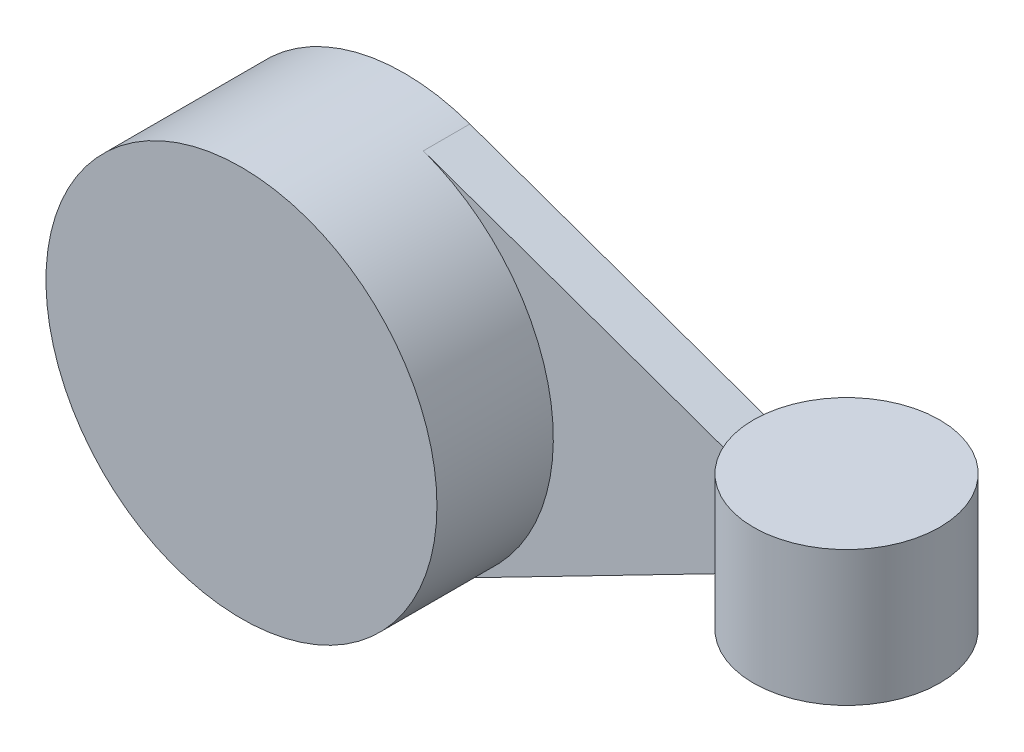
ISO-10303-21;
HEADER;
FILE_DESCRIPTION(('STEP AP214'),'2;1');
FILE_NAME('part.step','',(''),(''),'','','');
FILE_SCHEMA(('AUTOMOTIVE_DESIGN { 1 0 10303 214 1 1 1 1 }'));
ENDSEC;
DATA;
#1=APPLICATION_CONTEXT('core data for automotive mechanical design processes');
#2=APPLICATION_PROTOCOL_DEFINITION('international standard','automotive_design',2000,#1);
#3=PRODUCT_CONTEXT('',#1,'mechanical');
#4=PRODUCT('Part','Part','',(#3));
#5=PRODUCT_RELATED_PRODUCT_CATEGORY('part','',(#4));
#6=PRODUCT_DEFINITION_FORMATION('','',#4);
#7=PRODUCT_DEFINITION_CONTEXT('part definition',#1,'design');
#8=PRODUCT_DEFINITION('design','',#6,#7);
#9=PRODUCT_DEFINITION_SHAPE('','',#8);
#10=(LENGTH_UNIT() NAMED_UNIT(*) SI_UNIT(.MILLI.,.METRE.));
#11=(NAMED_UNIT(*) PLANE_ANGLE_UNIT() SI_UNIT($,.RADIAN.));
#12=(NAMED_UNIT(*) SI_UNIT($,.STERADIAN.) SOLID_ANGLE_UNIT());
#13=UNCERTAINTY_MEASURE_WITH_UNIT(LENGTH_MEASURE(1.E-05),#10,'distance_accuracy_value','');
#14=(GEOMETRIC_REPRESENTATION_CONTEXT(3) GLOBAL_UNCERTAINTY_ASSIGNED_CONTEXT((#13)) GLOBAL_UNIT_ASSIGNED_CONTEXT((#10,
#11,#12)) REPRESENTATION_CONTEXT('',''));
#15=CARTESIAN_POINT('',(0.,0.,0.));
#16=DIRECTION('',(0.,0.,1.));
#17=DIRECTION('',(1.,0.,0.));
#18=AXIS2_PLACEMENT_3D('',#15,#16,#17);
#19=CARTESIAN_POINT('',(19.208719722318,-37.350034626884,-35.));
#20=DIRECTION('',(-0.457350469579,0.889286538735333,0.));
#21=DIRECTION('',(-0.889286538735333,-0.457350469579,0.));
#22=AXIS2_PLACEMENT_3D('',#19,#20,#21);
#23=PLANE('',#22);
#24=DIRECTION('',(0.889286538735332,0.457350469579,0.));
#25=VECTOR('',#24,1.);
#26=CARTESIAN_POINT('',(19.208719722318,-37.350034626884,-25.));
#27=LINE('',#26,#25);
#28=CARTESIAN_POINT('',(19.208719722318,-37.350034626884,-25.));
#29=VERTEX_POINT('',#28);
#30=CARTESIAN_POINT('',(80.6350832689629,-5.75911877591379,-25.));
#31=VERTEX_POINT('',#30);
#32=EDGE_CURVE('E130',#29,#31,#27,.T.);
#33=ORIENTED_EDGE('',*,*,#32,.F.);
#34=DIRECTION('',(0.,0.,1.));
#35=VECTOR('',#34,1.);
#36=CARTESIAN_POINT('',(19.208719722318,-37.350034626884,-35.));
#37=LINE('',#36,#35);
#38=CARTESIAN_POINT('',(19.208719722318,-37.350034626884,-35.));
#39=VERTEX_POINT('',#38);
#40=EDGE_CURVE('E144',#39,#29,#37,.T.);
#41=ORIENTED_EDGE('',*,*,#40,.F.);
#42=DIRECTION('',(0.889286538735332,0.457350469579,0.));
#43=VECTOR('',#42,1.);
#44=CARTESIAN_POINT('',(19.208719722318,-37.350034626884,-35.));
#45=LINE('',#44,#43);
#46=CARTESIAN_POINT('',(80.6350832689629,-5.7591187759138,-35.));
#47=VERTEX_POINT('',#46);
#48=EDGE_CURVE('E135',#39,#47,#45,.T.);
#49=ORIENTED_EDGE('',*,*,#48,.T.);
#50=CARTESIAN_POINT('',(100.,4.20004891023278,-30.));
#51=DIRECTION('',(0.457350469579,-0.889286538735333,0.));
#52=DIRECTION('',(0.889286538735333,0.457350469579,0.));
#53=AXIS2_PLACEMENT_3D('',#50,#51,#52);
#54=ELLIPSE('',#53,22.4899389891163,20.);
#55=EDGE_CURVE('E118',#31,#47,#54,.T.);
#56=ORIENTED_EDGE('',*,*,#55,.F.);
#57=EDGE_LOOP('',(#33,#41,#49,#56));
#58=FACE_BOUND('',#57,.T.);
#59=ADVANCED_FACE('F37',(#58),#23,.F.);
#60=CARTESIAN_POINT('',(0.,0.,-35.));
#61=DIRECTION('',(0.,0.,-1.));
#62=DIRECTION('',(1.,0.,0.));
#63=AXIS2_PLACEMENT_3D('',#60,#61,#62);
#64=PLANE('',#63);
#65=DIRECTION('',(0.,1.,0.));
#66=VECTOR('',#65,1.);
#67=CARTESIAN_POINT('',(80.6350832689629,22.7172907254556,-35.));
#68=LINE('',#67,#66);
#69=CARTESIAN_POINT('',(80.6350832689629,15.9073805264409,-35.));
#70=VERTEX_POINT('',#69);
#71=EDGE_CURVE('E102',#70,#47,#68,.F.);
#72=ORIENTED_EDGE('',*,*,#71,.T.);
#73=ORIENTED_EDGE('',*,*,#48,.F.);
#74=CARTESIAN_POINT('',(0.,0.,-35.));
#75=DIRECTION('',(0.,0.,1.));
#76=DIRECTION('',(1.,0.,0.));
#77=AXIS2_PLACEMENT_3D('',#74,#75,#76);
#78=CIRCLE('',#77,42.);
#79=CARTESIAN_POINT('',(14.0694537438422,39.5733555735407,-35.));
#80=VERTEX_POINT('',#79);
#81=EDGE_CURVE('E133',#80,#39,#78,.T.);
#82=ORIENTED_EDGE('',*,*,#81,.F.);
#83=DIRECTION('',(-0.942222751750969,0.334986993901005,0.));
#84=VECTOR('',#83,1.);
#85=CARTESIAN_POINT('',(14.0694537438422,39.5733555735407,-35.));
#86=LINE('',#85,#84);
#87=EDGE_CURVE('E129',#70,#80,#86,.T.);
#88=ORIENTED_EDGE('',*,*,#87,.F.);
#89=EDGE_LOOP('',(#72,#73,#82,#88));
#90=FACE_BOUND('',#89,.T.);
#91=ADVANCED_FACE('F167',(#90),#64,.T.);
#92=CARTESIAN_POINT('',(0.,0.,-25.));
#93=DIRECTION('',(0.,0.,-1.));
#94=DIRECTION('',(1.,0.,0.));
#95=AXIS2_PLACEMENT_3D('',#92,#93,#94);
#96=PLANE('',#95);
#97=DIRECTION('',(-0.942222751750969,0.334986993901005,0.));
#98=VECTOR('',#97,1.);
#99=CARTESIAN_POINT('',(14.0694537438422,39.5733555735407,-25.));
#100=LINE('',#99,#98);
#101=CARTESIAN_POINT('',(80.6350832689629,15.9073805264409,-25.));
#102=VERTEX_POINT('',#101);
#103=CARTESIAN_POINT('',(14.0694537438422,39.5733555735407,-25.));
#104=VERTEX_POINT('',#103);
#105=EDGE_CURVE('E101',#102,#104,#100,.T.);
#106=ORIENTED_EDGE('',*,*,#105,.T.);
#107=CARTESIAN_POINT('',(0.,0.,-25.));
#108=DIRECTION('',(0.,0.,1.));
#109=DIRECTION('',(1.,0.,0.));
#110=AXIS2_PLACEMENT_3D('',#107,#108,#109);
#111=CIRCLE('',#110,42.);
#112=EDGE_CURVE('E106',#29,#104,#111,.T.);
#113=ORIENTED_EDGE('',*,*,#112,.F.);
#114=ORIENTED_EDGE('',*,*,#32,.T.);
#115=DIRECTION('',(0.,1.,0.));
#116=VECTOR('',#115,1.);
#117=CARTESIAN_POINT('',(80.6350832689629,22.7172907254556,-25.));
#118=LINE('',#117,#116);
#119=EDGE_CURVE('E11',#102,#31,#118,.F.);
#120=ORIENTED_EDGE('',*,*,#119,.F.);
#121=EDGE_LOOP('',(#106,#113,#114,#120));
#122=FACE_BOUND('',#121,.T.);
#123=ADVANCED_FACE('F159',(#122),#96,.F.);
#124=CARTESIAN_POINT('',(0.,0.,-30.));
#125=DIRECTION('',(0.,0.,1.));
#126=DIRECTION('',(-1.,0.,0.));
#127=AXIS2_PLACEMENT_3D('',#124,#125,#126);
#128=CYLINDRICAL_SURFACE('',#127,42.);
#129=ORIENTED_EDGE('',*,*,#112,.T.);
#130=DIRECTION('',(0.,0.,1.));
#131=VECTOR('',#130,1.);
#132=CARTESIAN_POINT('',(14.0694537438422,39.5733555735407,-35.));
#133=LINE('',#132,#131);
#134=EDGE_CURVE('E147',#80,#104,#133,.T.);
#135=ORIENTED_EDGE('',*,*,#134,.F.);
#136=ORIENTED_EDGE('',*,*,#81,.T.);
#137=ORIENTED_EDGE('',*,*,#40,.T.);
#138=EDGE_LOOP('',(#129,#135,#136,#137));
#139=FACE_BOUND('',#138,.T.);
#140=CARTESIAN_POINT('',(0.,0.,0.));
#141=DIRECTION('',(0.,0.,1.));
#142=DIRECTION('',(1.,0.,0.));
#143=AXIS2_PLACEMENT_3D('',#140,#141,#142);
#144=CIRCLE('',#143,42.);
#145=CARTESIAN_POINT('',(42.,0.,0.));
#146=VERTEX_POINT('',#145);
#147=EDGE_CURVE('E149',#146,#146,#144,.T.);
#148=ORIENTED_EDGE('',*,*,#147,.F.);
#149=EDGE_LOOP('',(#148));
#150=FACE_BOUND('',#149,.T.);
#151=ADVANCED_FACE('F39',(#139,#150),#128,.T.);
#152=CARTESIAN_POINT('',(0.,0.,0.));
#153=DIRECTION('',(0.,0.,-1.));
#154=DIRECTION('',(1.,0.,0.));
#155=AXIS2_PLACEMENT_3D('',#152,#153,#154);
#156=PLANE('',#155);
#157=ORIENTED_EDGE('',*,*,#147,.T.);
#158=EDGE_LOOP('',(#157));
#159=FACE_BOUND('',#158,.T.);
#160=ADVANCED_FACE('F221',(#159),#156,.F.);
#161=CARTESIAN_POINT('',(14.0694537438422,39.5733555735407,-35.));
#162=DIRECTION('',(-0.334986993901005,-0.942222751750969,0.));
#163=DIRECTION('',(0.942222751750969,-0.334986993901005,0.));
#164=AXIS2_PLACEMENT_3D('',#161,#162,#163);
#165=PLANE('',#164);
#166=ORIENTED_EDGE('',*,*,#87,.T.);
#167=ORIENTED_EDGE('',*,*,#134,.T.);
#168=ORIENTED_EDGE('',*,*,#105,.F.);
#169=CARTESIAN_POINT('',(100.,9.02260170867366,-30.));
#170=DIRECTION('',(0.334986993901005,0.942222751750969,0.));
#171=DIRECTION('',(-0.942222751750969,0.334986993901005,0.));
#172=AXIS2_PLACEMENT_3D('',#169,#170,#171);
#173=ELLIPSE('',#172,21.2264031651042,20.);
#174=EDGE_CURVE('E121',#70,#102,#173,.T.);
#175=ORIENTED_EDGE('',*,*,#174,.F.);
#176=EDGE_LOOP('',(#166,#167,#168,#175));
#177=FACE_BOUND('',#176,.T.);
#178=ADVANCED_FACE('F161',(#177),#165,.F.);
#179=CARTESIAN_POINT('',(100.,0.,-30.));
#180=DIRECTION('',(0.,1.,0.));
#181=DIRECTION('',(-1.,0.,0.));
#182=AXIS2_PLACEMENT_3D('',#179,#180,#181);
#183=SPHERICAL_SURFACE('',#182,15.);
#184=CARTESIAN_POINT('',(100.,-8.99999999999999,-30.));
#185=DIRECTION('',(0.,-1.,0.));
#186=DIRECTION('',(0.,0.,-1.));
#187=AXIS2_PLACEMENT_3D('',#184,#185,#186);
#188=CIRCLE('',#187,12.);
#189=CARTESIAN_POINT('',(100.,-8.99999999999999,-42.));
#190=VERTEX_POINT('',#189);
#191=EDGE_CURVE('E182',#190,#190,#188,.T.);
#192=ORIENTED_EDGE('',*,*,#191,.T.);
#193=EDGE_LOOP('',(#192));
#194=FACE_BOUND('',#193,.T.);
#195=CARTESIAN_POINT('',(86.,0.,-30.));
#196=DIRECTION('',(1.,0.,0.));
#197=DIRECTION('',(0.,0.,-1.));
#198=AXIS2_PLACEMENT_3D('',#195,#196,#197);
#199=CIRCLE('',#198,5.38516480713447);
#200=CARTESIAN_POINT('',(86.,-1.9999999999999,-35.));
#201=VERTEX_POINT('',#200);
#202=CARTESIAN_POINT('',(86.,-2.99999999999999,-34.4721359549995));
#203=VERTEX_POINT('',#202);
#204=EDGE_CURVE('E113',#201,#203,#199,.F.);
#205=ORIENTED_EDGE('',*,*,#204,.T.);
#206=CARTESIAN_POINT('',(98.2917745199048,3.32152698120484,-30.));
#207=DIRECTION('',(0.457350469579,-0.889286538735333,0.));
#208=DIRECTION('',(-0.889286538735333,-0.457350469579,0.));
#209=AXIS2_PLACEMENT_3D('',#206,#207,#208);
#210=CIRCLE('',#209,14.5275401986118);
#211=CARTESIAN_POINT('',(86.,-3.,-25.5278640450005));
#212=VERTEX_POINT('',#211);
#213=EDGE_CURVE('E110',#203,#212,#210,.F.);
#214=ORIENTED_EDGE('',*,*,#213,.T.);
#215=CARTESIAN_POINT('',(86.,-1.99999999999989,-25.));
#216=VERTEX_POINT('',#215);
#217=EDGE_CURVE('E96',#212,#216,#199,.F.);
#218=ORIENTED_EDGE('',*,*,#217,.T.);
#219=CARTESIAN_POINT('',(100.,0.,-25.));
#220=DIRECTION('',(0.,0.,1.));
#221=DIRECTION('',(1.,0.,0.));
#222=AXIS2_PLACEMENT_3D('',#219,#220,#221);
#223=CIRCLE('',#222,14.1421356237309);
#224=CARTESIAN_POINT('',(86.,1.99999999999989,-25.));
#225=VERTEX_POINT('',#224);
#226=EDGE_CURVE('E45',#216,#225,#223,.F.);
#227=ORIENTED_EDGE('',*,*,#226,.T.);
#228=CARTESIAN_POINT('',(86.,1.99999999999991,-35.));
#229=VERTEX_POINT('',#228);
#230=EDGE_CURVE('E99',#225,#229,#199,.F.);
#231=ORIENTED_EDGE('',*,*,#230,.T.);
#232=CARTESIAN_POINT('',(100.,0.,-35.));
#233=DIRECTION('',(0.,0.,1.));
#234=DIRECTION('',(1.,0.,0.));
#235=AXIS2_PLACEMENT_3D('',#232,#233,#234);
#236=CIRCLE('',#235,14.1421356237309);
#237=EDGE_CURVE('E111',#201,#229,#236,.F.);
#238=ORIENTED_EDGE('',*,*,#237,.F.);
#239=EDGE_LOOP('',(#205,#214,#218,#227,#231,#238));
#240=FACE_BOUND('',#239,.T.);
#241=ADVANCED_FACE('F108',(#194,#240),#183,.F.);
#242=CARTESIAN_POINT('',(80.,20.,-30.));
#243=DIRECTION('',(0.,1.,0.));
#244=DIRECTION('',(0.,0.,-1.));
#245=AXIS2_PLACEMENT_3D('',#242,#243,#244);
#246=PLANE('',#245);
#247=CARTESIAN_POINT('',(100.,20.,-30.));
#248=DIRECTION('',(0.,-1.,0.));
#249=DIRECTION('',(0.,0.,-1.));
#250=AXIS2_PLACEMENT_3D('',#247,#248,#249);
#251=CIRCLE('',#250,20.);
#252=CARTESIAN_POINT('',(100.,20.,-50.));
#253=VERTEX_POINT('',#252);
#254=EDGE_CURVE('E116',#253,#253,#251,.T.);
#255=ORIENTED_EDGE('',*,*,#254,.F.);
#256=EDGE_LOOP('',(#255));
#257=FACE_BOUND('',#256,.T.);
#258=ADVANCED_FACE('F173',(#257),#246,.T.);
#259=CARTESIAN_POINT('',(100.,22.7172907254556,-30.));
#260=DIRECTION('',(0.,1.,0.));
#261=DIRECTION('',(0.,0.,-1.));
#262=AXIS2_PLACEMENT_3D('',#259,#260,#261);
#263=CYLINDRICAL_SURFACE('',#262,20.);
#264=ORIENTED_EDGE('',*,*,#174,.T.);
#265=ORIENTED_EDGE('',*,*,#119,.T.);
#266=ORIENTED_EDGE('',*,*,#55,.T.);
#267=ORIENTED_EDGE('',*,*,#71,.F.);
#268=EDGE_LOOP('',(#264,#265,#266,#267));
#269=FACE_BOUND('',#268,.T.);
#270=CARTESIAN_POINT('',(100.,-9.,-30.));
#271=DIRECTION('',(0.,-1.,0.));
#272=DIRECTION('',(0.,0.,-1.));
#273=AXIS2_PLACEMENT_3D('',#270,#271,#272);
#274=CIRCLE('',#273,20.);
#275=CARTESIAN_POINT('',(100.,-9.,-50.));
#276=VERTEX_POINT('',#275);
#277=EDGE_CURVE('E178',#276,#276,#274,.T.);
#278=ORIENTED_EDGE('',*,*,#277,.F.);
#279=EDGE_LOOP('',(#278));
#280=FACE_BOUND('',#279,.T.);
#281=ORIENTED_EDGE('',*,*,#254,.T.);
#282=EDGE_LOOP('',(#281));
#283=FACE_BOUND('',#282,.T.);
#284=ADVANCED_FACE('F169',(#269,#280,#283),#263,.T.);
#285=CARTESIAN_POINT('',(80.,-9.,-30.));
#286=DIRECTION('',(0.,-1.,0.));
#287=DIRECTION('',(0.,0.,1.));
#288=AXIS2_PLACEMENT_3D('',#285,#286,#287);
#289=PLANE('',#288);
#290=ORIENTED_EDGE('',*,*,#191,.F.);
#291=EDGE_LOOP('',(#290));
#292=FACE_BOUND('',#291,.T.);
#293=ORIENTED_EDGE('',*,*,#277,.T.);
#294=EDGE_LOOP('',(#293));
#295=FACE_BOUND('',#294,.T.);
#296=ADVANCED_FACE('F172',(#292,#295),#289,.T.);
#297=DIRECTION('',(0.,1.,0.));
#298=VECTOR('',#297,1.);
#299=CARTESIAN_POINT('',(86.,14.,-25.));
#300=LINE('',#299,#298);
#301=EDGE_CURVE('E51',#216,#225,#300,.T.);
#302=ORIENTED_EDGE('',*,*,#301,.T.);
#303=ORIENTED_EDGE('',*,*,#226,.F.);
#304=EDGE_LOOP('',(#302,#303));
#305=FACE_BOUND('',#304,.T.);
#306=ADVANCED_FACE('F104',(#305),#96,.F.);
#307=DIRECTION('',(0.,0.,1.));
#308=VECTOR('',#307,1.);
#309=CARTESIAN_POINT('',(86.,-3.,-35.));
#310=LINE('',#309,#308);
#311=EDGE_CURVE('E137',#203,#212,#310,.T.);
#312=ORIENTED_EDGE('',*,*,#311,.T.);
#313=ORIENTED_EDGE('',*,*,#213,.F.);
#314=EDGE_LOOP('',(#312,#313));
#315=FACE_BOUND('',#314,.T.);
#316=ADVANCED_FACE('F195',(#315),#23,.F.);
#317=ORIENTED_EDGE('',*,*,#237,.T.);
#318=DIRECTION('',(0.,1.,0.));
#319=VECTOR('',#318,1.);
#320=CARTESIAN_POINT('',(86.,14.,-35.));
#321=LINE('',#320,#319);
#322=EDGE_CURVE('E127',#201,#229,#321,.T.);
#323=ORIENTED_EDGE('',*,*,#322,.F.);
#324=EDGE_LOOP('',(#317,#323));
#325=FACE_BOUND('',#324,.T.);
#326=ADVANCED_FACE('F204',(#325),#64,.T.);
#327=CARTESIAN_POINT('',(86.,14.,-35.));
#328=DIRECTION('',(-1.,0.,0.));
#329=DIRECTION('',(0.,0.,-1.));
#330=AXIS2_PLACEMENT_3D('',#327,#328,#329);
#331=PLANE('',#330);
#332=ORIENTED_EDGE('',*,*,#322,.T.);
#333=ORIENTED_EDGE('',*,*,#230,.F.);
#334=ORIENTED_EDGE('',*,*,#301,.F.);
#335=ORIENTED_EDGE('',*,*,#217,.F.);
#336=ORIENTED_EDGE('',*,*,#311,.F.);
#337=ORIENTED_EDGE('',*,*,#204,.F.);
#338=EDGE_LOOP('',(#332,#333,#334,#335,#336,#337));
#339=FACE_BOUND('',#338,.T.);
#340=ADVANCED_FACE('F94',(#339),#331,.F.);
#341=CLOSED_SHELL('',(#59,#91,#123,#151,#160,#178,#241,#258,#284,#296,#306,#316,#326,#340));
#342=MANIFOLD_SOLID_BREP('B2',#341);
#343=ADVANCED_BREP_SHAPE_REPRESENTATION('',(#18,#342),#14);
#344=SHAPE_DEFINITION_REPRESENTATION(#9,#343);
ENDSEC;
END-ISO-10303-21;
